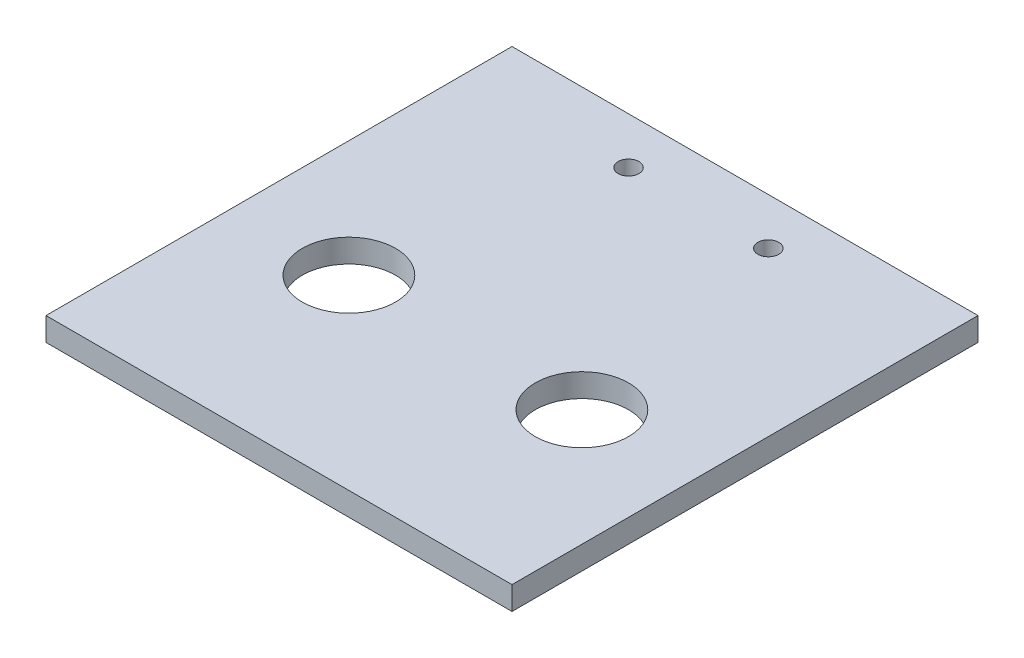
ISO-10303-21;
HEADER;
FILE_DESCRIPTION(('STEP AP214'),'2;1');
FILE_NAME('part.step','',(''),(''),'','','');
FILE_SCHEMA(('AUTOMOTIVE_DESIGN { 1 0 10303 214 1 1 1 1 }'));
ENDSEC;
DATA;
#1=APPLICATION_CONTEXT('core data for automotive mechanical design processes');
#2=APPLICATION_PROTOCOL_DEFINITION('international standard','automotive_design',2000,#1);
#3=PRODUCT_CONTEXT('',#1,'mechanical');
#4=PRODUCT('Part','Part','',(#3));
#5=PRODUCT_RELATED_PRODUCT_CATEGORY('part','',(#4));
#6=PRODUCT_DEFINITION_FORMATION('','',#4);
#7=PRODUCT_DEFINITION_CONTEXT('part definition',#1,'design');
#8=PRODUCT_DEFINITION('design','',#6,#7);
#9=PRODUCT_DEFINITION_SHAPE('','',#8);
#10=(LENGTH_UNIT() NAMED_UNIT(*) SI_UNIT(.MILLI.,.METRE.));
#11=(NAMED_UNIT(*) PLANE_ANGLE_UNIT() SI_UNIT($,.RADIAN.));
#12=(NAMED_UNIT(*) SI_UNIT($,.STERADIAN.) SOLID_ANGLE_UNIT());
#13=UNCERTAINTY_MEASURE_WITH_UNIT(LENGTH_MEASURE(1.E-05),#10,'distance_accuracy_value','');
#14=(GEOMETRIC_REPRESENTATION_CONTEXT(3) GLOBAL_UNCERTAINTY_ASSIGNED_CONTEXT((#13)) GLOBAL_UNIT_ASSIGNED_CONTEXT((#10,
#11,#12)) REPRESENTATION_CONTEXT('',''));
#15=CARTESIAN_POINT('',(0.,0.,0.));
#16=DIRECTION('',(0.,0.,1.));
#17=DIRECTION('',(1.,0.,0.));
#18=AXIS2_PLACEMENT_3D('',#15,#16,#17);
#19=CARTESIAN_POINT('',(0.,3.175,0.));
#20=DIRECTION('',(0.,-1.,0.));
#21=DIRECTION('',(0.,0.,-1.));
#22=AXIS2_PLACEMENT_3D('',#19,#20,#21);
#23=PLANE('',#22);
#24=CARTESIAN_POINT('',(22.225,3.175,-57.15));
#25=DIRECTION('',(0.,1.,0.));
#26=DIRECTION('',(0.,0.,1.));
#27=AXIS2_PLACEMENT_3D('',#24,#25,#26);
#28=CIRCLE('',#27,1.4224);
#29=CARTESIAN_POINT('',(22.225,3.175,-55.7276));
#30=VERTEX_POINT('',#29);
#31=EDGE_CURVE('E121',#30,#30,#28,.T.);
#32=ORIENTED_EDGE('',*,*,#31,.F.);
#33=EDGE_LOOP('',(#32));
#34=FACE_BOUND('',#33,.T.);
#35=CARTESIAN_POINT('',(15.875,3.175,-25.4));
#36=DIRECTION('',(0.,1.,0.));
#37=DIRECTION('',(0.,0.,1.));
#38=AXIS2_PLACEMENT_3D('',#35,#36,#37);
#39=CIRCLE('',#38,6.35);
#40=CARTESIAN_POINT('',(15.875,3.175,-19.05));
#41=VERTEX_POINT('',#40);
#42=EDGE_CURVE('E100',#41,#41,#39,.T.);
#43=ORIENTED_EDGE('',*,*,#42,.F.);
#44=EDGE_LOOP('',(#43));
#45=FACE_BOUND('',#44,.T.);
#46=DIRECTION('',(0.,0.,1.));
#47=VECTOR('',#46,1.);
#48=CARTESIAN_POINT('',(0.,3.175,0.));
#49=LINE('',#48,#47);
#50=CARTESIAN_POINT('',(0.,3.175,-63.5));
#51=VERTEX_POINT('',#50);
#52=CARTESIAN_POINT('',(0.,3.175,0.));
#53=VERTEX_POINT('',#52);
#54=EDGE_CURVE('E85',#51,#53,#49,.T.);
#55=ORIENTED_EDGE('',*,*,#54,.T.);
#56=DIRECTION('',(1.,0.,0.));
#57=VECTOR('',#56,1.);
#58=CARTESIAN_POINT('',(0.,3.175,0.));
#59=LINE('',#58,#57);
#60=CARTESIAN_POINT('',(63.5,3.175,0.));
#61=VERTEX_POINT('',#60);
#62=EDGE_CURVE('E80',#53,#61,#59,.T.);
#63=ORIENTED_EDGE('',*,*,#62,.T.);
#64=DIRECTION('',(0.,0.,-1.));
#65=VECTOR('',#64,1.);
#66=CARTESIAN_POINT('',(63.5,3.175,0.));
#67=LINE('',#66,#65);
#68=CARTESIAN_POINT('',(63.5,3.175,-63.5));
#69=VERTEX_POINT('',#68);
#70=EDGE_CURVE('E83',#61,#69,#67,.T.);
#71=ORIENTED_EDGE('',*,*,#70,.T.);
#72=DIRECTION('',(-1.,0.,0.));
#73=VECTOR('',#72,1.);
#74=CARTESIAN_POINT('',(0.,3.175,-63.5));
#75=LINE('',#74,#73);
#76=EDGE_CURVE('E50',#69,#51,#75,.T.);
#77=ORIENTED_EDGE('',*,*,#76,.T.);
#78=EDGE_LOOP('',(#55,#63,#71,#77));
#79=FACE_BOUND('',#78,.T.);
#80=CARTESIAN_POINT('',(47.625,3.175,-25.4));
#81=DIRECTION('',(0.,1.,0.));
#82=DIRECTION('',(0.,0.,1.));
#83=AXIS2_PLACEMENT_3D('',#80,#81,#82);
#84=CIRCLE('',#83,6.35);
#85=CARTESIAN_POINT('',(47.625,3.175,-19.05));
#86=VERTEX_POINT('',#85);
#87=EDGE_CURVE('E115',#86,#86,#84,.T.);
#88=ORIENTED_EDGE('',*,*,#87,.F.);
#89=EDGE_LOOP('',(#88));
#90=FACE_BOUND('',#89,.T.);
#91=CARTESIAN_POINT('',(41.275,3.175,-57.15));
#92=DIRECTION('',(0.,1.,0.));
#93=DIRECTION('',(0.,0.,1.));
#94=AXIS2_PLACEMENT_3D('',#91,#92,#93);
#95=CIRCLE('',#94,1.4224);
#96=CARTESIAN_POINT('',(41.275,3.175,-55.7276));
#97=VERTEX_POINT('',#96);
#98=EDGE_CURVE('E127',#97,#97,#95,.T.);
#99=ORIENTED_EDGE('',*,*,#98,.F.);
#100=EDGE_LOOP('',(#99));
#101=FACE_BOUND('',#100,.T.);
#102=ADVANCED_FACE('F33',(#34,#45,#79,#90,#101),#23,.F.);
#103=CARTESIAN_POINT('',(0.,0.,0.));
#104=DIRECTION('',(0.,-1.,0.));
#105=DIRECTION('',(0.,0.,-1.));
#106=AXIS2_PLACEMENT_3D('',#103,#104,#105);
#107=PLANE('',#106);
#108=CARTESIAN_POINT('',(22.225,0.,-57.15));
#109=DIRECTION('',(0.,1.,0.));
#110=DIRECTION('',(0.,0.,1.));
#111=AXIS2_PLACEMENT_3D('',#108,#109,#110);
#112=CIRCLE('',#111,1.4224);
#113=CARTESIAN_POINT('',(22.225,0.,-55.7276));
#114=VERTEX_POINT('',#113);
#115=EDGE_CURVE('E124',#114,#114,#112,.T.);
#116=ORIENTED_EDGE('',*,*,#115,.T.);
#117=EDGE_LOOP('',(#116));
#118=FACE_BOUND('',#117,.T.);
#119=CARTESIAN_POINT('',(15.875,0.,-25.4));
#120=DIRECTION('',(0.,1.,0.));
#121=DIRECTION('',(0.,0.,1.));
#122=AXIS2_PLACEMENT_3D('',#119,#120,#121);
#123=CIRCLE('',#122,6.35);
#124=CARTESIAN_POINT('',(15.875,0.,-19.05));
#125=VERTEX_POINT('',#124);
#126=EDGE_CURVE('E112',#125,#125,#123,.T.);
#127=ORIENTED_EDGE('',*,*,#126,.T.);
#128=EDGE_LOOP('',(#127));
#129=FACE_BOUND('',#128,.T.);
#130=DIRECTION('',(0.,0.,1.));
#131=VECTOR('',#130,1.);
#132=CARTESIAN_POINT('',(0.,0.,0.));
#133=LINE('',#132,#131);
#134=CARTESIAN_POINT('',(0.,0.,-63.5));
#135=VERTEX_POINT('',#134);
#136=CARTESIAN_POINT('',(0.,0.,0.));
#137=VERTEX_POINT('',#136);
#138=EDGE_CURVE('E97',#135,#137,#133,.T.);
#139=ORIENTED_EDGE('',*,*,#138,.F.);
#140=DIRECTION('',(-1.,0.,0.));
#141=VECTOR('',#140,1.);
#142=CARTESIAN_POINT('',(0.,0.,-63.5));
#143=LINE('',#142,#141);
#144=CARTESIAN_POINT('',(63.5,0.,-63.5));
#145=VERTEX_POINT('',#144);
#146=EDGE_CURVE('E73',#145,#135,#143,.T.);
#147=ORIENTED_EDGE('',*,*,#146,.F.);
#148=DIRECTION('',(0.,0.,-1.));
#149=VECTOR('',#148,1.);
#150=CARTESIAN_POINT('',(63.5,0.,0.));
#151=LINE('',#150,#149);
#152=CARTESIAN_POINT('',(63.5,0.,0.));
#153=VERTEX_POINT('',#152);
#154=EDGE_CURVE('E67',#153,#145,#151,.T.);
#155=ORIENTED_EDGE('',*,*,#154,.F.);
#156=DIRECTION('',(1.,0.,0.));
#157=VECTOR('',#156,1.);
#158=CARTESIAN_POINT('',(0.,0.,0.));
#159=LINE('',#158,#157);
#160=EDGE_CURVE('E89',#137,#153,#159,.T.);
#161=ORIENTED_EDGE('',*,*,#160,.F.);
#162=EDGE_LOOP('',(#139,#147,#155,#161));
#163=FACE_BOUND('',#162,.T.);
#164=CARTESIAN_POINT('',(47.625,0.,-25.4));
#165=DIRECTION('',(0.,1.,0.));
#166=DIRECTION('',(0.,0.,1.));
#167=AXIS2_PLACEMENT_3D('',#164,#165,#166);
#168=CIRCLE('',#167,6.35);
#169=CARTESIAN_POINT('',(47.625,0.,-19.05));
#170=VERTEX_POINT('',#169);
#171=EDGE_CURVE('E118',#170,#170,#168,.T.);
#172=ORIENTED_EDGE('',*,*,#171,.T.);
#173=EDGE_LOOP('',(#172));
#174=FACE_BOUND('',#173,.T.);
#175=CARTESIAN_POINT('',(41.275,0.,-57.15));
#176=DIRECTION('',(0.,1.,0.));
#177=DIRECTION('',(0.,0.,1.));
#178=AXIS2_PLACEMENT_3D('',#175,#176,#177);
#179=CIRCLE('',#178,1.4224);
#180=CARTESIAN_POINT('',(41.275,0.,-55.7276));
#181=VERTEX_POINT('',#180);
#182=EDGE_CURVE('E130',#181,#181,#179,.T.);
#183=ORIENTED_EDGE('',*,*,#182,.T.);
#184=EDGE_LOOP('',(#183));
#185=FACE_BOUND('',#184,.T.);
#186=ADVANCED_FACE('F108',(#118,#129,#163,#174,#185),#107,.T.);
#187=CARTESIAN_POINT('',(0.,3.175,0.));
#188=DIRECTION('',(1.,0.,0.));
#189=DIRECTION('',(0.,0.,-1.));
#190=AXIS2_PLACEMENT_3D('',#187,#188,#189);
#191=PLANE('',#190);
#192=ORIENTED_EDGE('',*,*,#138,.T.);
#193=DIRECTION('',(0.,-1.,0.));
#194=VECTOR('',#193,1.);
#195=CARTESIAN_POINT('',(0.,3.175,0.));
#196=LINE('',#195,#194);
#197=EDGE_CURVE('E11',#53,#137,#196,.T.);
#198=ORIENTED_EDGE('',*,*,#197,.F.);
#199=ORIENTED_EDGE('',*,*,#54,.F.);
#200=DIRECTION('',(0.,-1.,0.));
#201=VECTOR('',#200,1.);
#202=CARTESIAN_POINT('',(0.,3.175,-63.5));
#203=LINE('',#202,#201);
#204=EDGE_CURVE('E93',#51,#135,#203,.T.);
#205=ORIENTED_EDGE('',*,*,#204,.T.);
#206=EDGE_LOOP('',(#192,#198,#199,#205));
#207=FACE_BOUND('',#206,.T.);
#208=ADVANCED_FACE('F35',(#207),#191,.F.);
#209=CARTESIAN_POINT('',(0.,3.175,0.));
#210=DIRECTION('',(0.,0.,-1.));
#211=DIRECTION('',(-1.,0.,0.));
#212=AXIS2_PLACEMENT_3D('',#209,#210,#211);
#213=PLANE('',#212);
#214=ORIENTED_EDGE('',*,*,#160,.T.);
#215=DIRECTION('',(0.,-1.,0.));
#216=VECTOR('',#215,1.);
#217=CARTESIAN_POINT('',(63.5,3.175,0.));
#218=LINE('',#217,#216);
#219=EDGE_CURVE('E42',#61,#153,#218,.T.);
#220=ORIENTED_EDGE('',*,*,#219,.F.);
#221=ORIENTED_EDGE('',*,*,#62,.F.);
#222=ORIENTED_EDGE('',*,*,#197,.T.);
#223=EDGE_LOOP('',(#214,#220,#221,#222));
#224=FACE_BOUND('',#223,.T.);
#225=ADVANCED_FACE('F88',(#224),#213,.F.);
#226=CARTESIAN_POINT('',(63.5,3.175,0.));
#227=DIRECTION('',(-1.,0.,0.));
#228=DIRECTION('',(0.,0.,1.));
#229=AXIS2_PLACEMENT_3D('',#226,#227,#228);
#230=PLANE('',#229);
#231=ORIENTED_EDGE('',*,*,#154,.T.);
#232=DIRECTION('',(0.,-1.,0.));
#233=VECTOR('',#232,1.);
#234=CARTESIAN_POINT('',(63.5,3.175,-63.5));
#235=LINE('',#234,#233);
#236=EDGE_CURVE('E90',#69,#145,#235,.T.);
#237=ORIENTED_EDGE('',*,*,#236,.F.);
#238=ORIENTED_EDGE('',*,*,#70,.F.);
#239=ORIENTED_EDGE('',*,*,#219,.T.);
#240=EDGE_LOOP('',(#231,#237,#238,#239));
#241=FACE_BOUND('',#240,.T.);
#242=ADVANCED_FACE('F91',(#241),#230,.F.);
#243=CARTESIAN_POINT('',(0.,3.175,-63.5));
#244=DIRECTION('',(0.,0.,1.));
#245=DIRECTION('',(1.,0.,0.));
#246=AXIS2_PLACEMENT_3D('',#243,#244,#245);
#247=PLANE('',#246);
#248=ORIENTED_EDGE('',*,*,#146,.T.);
#249=ORIENTED_EDGE('',*,*,#204,.F.);
#250=ORIENTED_EDGE('',*,*,#76,.F.);
#251=ORIENTED_EDGE('',*,*,#236,.T.);
#252=EDGE_LOOP('',(#248,#249,#250,#251));
#253=FACE_BOUND('',#252,.T.);
#254=ADVANCED_FACE('F105',(#253),#247,.F.);
#255=CARTESIAN_POINT('',(15.875,3.175,-25.4));
#256=DIRECTION('',(0.,-1.,0.));
#257=DIRECTION('',(0.,0.,-1.));
#258=AXIS2_PLACEMENT_3D('',#255,#256,#257);
#259=CYLINDRICAL_SURFACE('',#258,6.35);
#260=ORIENTED_EDGE('',*,*,#42,.T.);
#261=EDGE_LOOP('',(#260));
#262=FACE_BOUND('',#261,.T.);
#263=ORIENTED_EDGE('',*,*,#126,.F.);
#264=EDGE_LOOP('',(#263));
#265=FACE_BOUND('',#264,.T.);
#266=ADVANCED_FACE('F150',(#262,#265),#259,.F.);
#267=CARTESIAN_POINT('',(47.625,3.175,-25.4));
#268=DIRECTION('',(0.,-1.,0.));
#269=DIRECTION('',(0.,0.,-1.));
#270=AXIS2_PLACEMENT_3D('',#267,#268,#269);
#271=CYLINDRICAL_SURFACE('',#270,6.35);
#272=ORIENTED_EDGE('',*,*,#87,.T.);
#273=EDGE_LOOP('',(#272));
#274=FACE_BOUND('',#273,.T.);
#275=ORIENTED_EDGE('',*,*,#171,.F.);
#276=EDGE_LOOP('',(#275));
#277=FACE_BOUND('',#276,.T.);
#278=ADVANCED_FACE('F196',(#274,#277),#271,.F.);
#279=CARTESIAN_POINT('',(22.225,3.175,-57.15));
#280=DIRECTION('',(0.,-1.,0.));
#281=DIRECTION('',(0.,0.,-1.));
#282=AXIS2_PLACEMENT_3D('',#279,#280,#281);
#283=CYLINDRICAL_SURFACE('',#282,1.4224);
#284=ORIENTED_EDGE('',*,*,#31,.T.);
#285=EDGE_LOOP('',(#284));
#286=FACE_BOUND('',#285,.T.);
#287=ORIENTED_EDGE('',*,*,#115,.F.);
#288=EDGE_LOOP('',(#287));
#289=FACE_BOUND('',#288,.T.);
#290=ADVANCED_FACE('F204',(#286,#289),#283,.F.);
#291=CARTESIAN_POINT('',(41.275,3.175,-57.15));
#292=DIRECTION('',(0.,-1.,0.));
#293=DIRECTION('',(0.,0.,-1.));
#294=AXIS2_PLACEMENT_3D('',#291,#292,#293);
#295=CYLINDRICAL_SURFACE('',#294,1.4224);
#296=ORIENTED_EDGE('',*,*,#98,.T.);
#297=EDGE_LOOP('',(#296));
#298=FACE_BOUND('',#297,.T.);
#299=ORIENTED_EDGE('',*,*,#182,.F.);
#300=EDGE_LOOP('',(#299));
#301=FACE_BOUND('',#300,.T.);
#302=ADVANCED_FACE('F136',(#298,#301),#295,.F.);
#303=CLOSED_SHELL('',(#102,#186,#208,#225,#242,#254,#266,#278,#290,#302));
#304=MANIFOLD_SOLID_BREP('B2',#303);
#305=ADVANCED_BREP_SHAPE_REPRESENTATION('',(#18,#304),#14);
#306=SHAPE_DEFINITION_REPRESENTATION(#9,#305);
ENDSEC;
END-ISO-10303-21;
